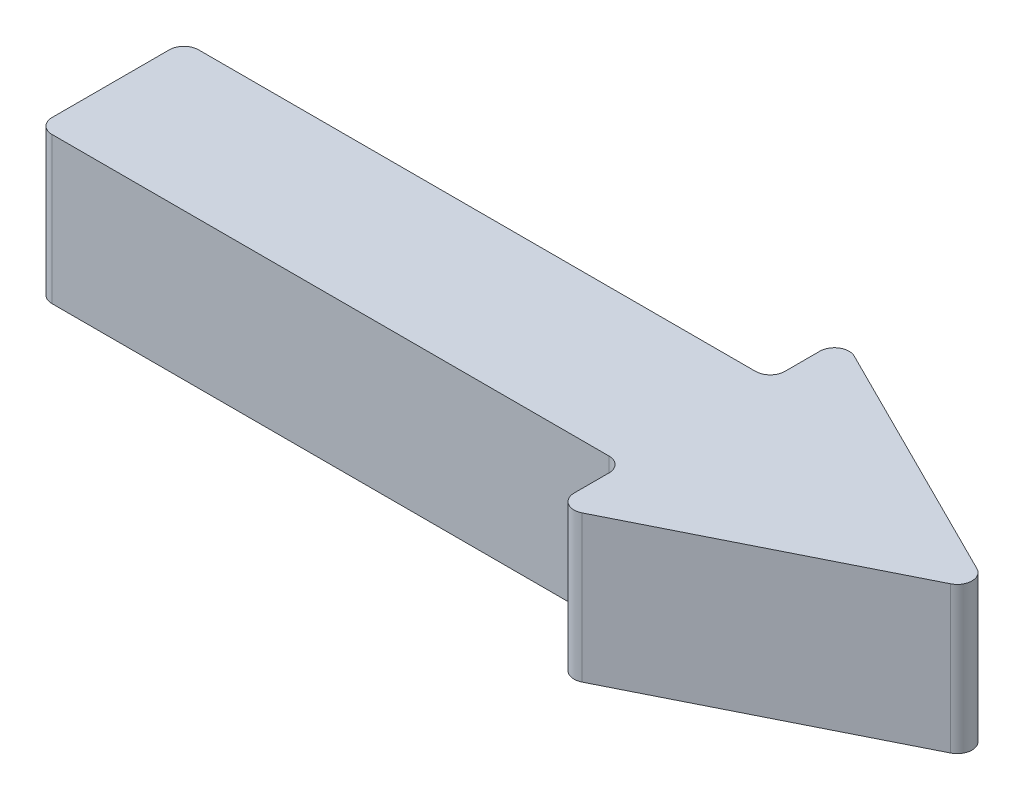
ISO-10303-21;
HEADER;
FILE_DESCRIPTION(('STEP AP214'),'2;1');
FILE_NAME('part.step','',(''),(''),'','','');
FILE_SCHEMA(('AUTOMOTIVE_DESIGN { 1 0 10303 214 1 1 1 1 }'));
ENDSEC;
DATA;
#1=APPLICATION_CONTEXT('core data for automotive mechanical design processes');
#2=APPLICATION_PROTOCOL_DEFINITION('international standard','automotive_design',2000,#1);
#3=PRODUCT_CONTEXT('',#1,'mechanical');
#4=PRODUCT('Part','Part','',(#3));
#5=PRODUCT_RELATED_PRODUCT_CATEGORY('part','',(#4));
#6=PRODUCT_DEFINITION_FORMATION('','',#4);
#7=PRODUCT_DEFINITION_CONTEXT('part definition',#1,'design');
#8=PRODUCT_DEFINITION('design','',#6,#7);
#9=PRODUCT_DEFINITION_SHAPE('','',#8);
#10=(LENGTH_UNIT() NAMED_UNIT(*) SI_UNIT(.MILLI.,.METRE.));
#11=(NAMED_UNIT(*) PLANE_ANGLE_UNIT() SI_UNIT($,.RADIAN.));
#12=(NAMED_UNIT(*) SI_UNIT($,.STERADIAN.) SOLID_ANGLE_UNIT());
#13=UNCERTAINTY_MEASURE_WITH_UNIT(LENGTH_MEASURE(1.E-05),#10,'distance_accuracy_value','');
#14=(GEOMETRIC_REPRESENTATION_CONTEXT(3) GLOBAL_UNCERTAINTY_ASSIGNED_CONTEXT((#13)) GLOBAL_UNIT_ASSIGNED_CONTEXT((#10,
#11,#12)) REPRESENTATION_CONTEXT('',''));
#15=CARTESIAN_POINT('',(0.,0.,0.));
#16=DIRECTION('',(0.,0.,1.));
#17=DIRECTION('',(1.,0.,0.));
#18=AXIS2_PLACEMENT_3D('',#15,#16,#17);
#19=CARTESIAN_POINT('',(0.,0.,0.));
#20=DIRECTION('',(0.,1.,0.));
#21=DIRECTION('',(0.,0.,1.));
#22=AXIS2_PLACEMENT_3D('',#19,#20,#21);
#23=PLANE('',#22);
#24=DIRECTION('',(1.,0.,0.));
#25=VECTOR('',#24,1.);
#26=CARTESIAN_POINT('',(0.,0.,0.));
#27=LINE('',#26,#25);
#28=CARTESIAN_POINT('',(0.635,0.,0.));
#29=VERTEX_POINT('',#28);
#30=CARTESIAN_POINT('',(24.765,0.,0.));
#31=VERTEX_POINT('',#30);
#32=EDGE_CURVE('E154',#29,#31,#27,.T.);
#33=ORIENTED_EDGE('',*,*,#32,.F.);
#34=CARTESIAN_POINT('',(0.635,0.,-0.635));
#35=DIRECTION('',(0.,1.,0.));
#36=DIRECTION('',(0.,0.,1.));
#37=AXIS2_PLACEMENT_3D('',#34,#35,#36);
#38=CIRCLE('',#37,0.635);
#39=CARTESIAN_POINT('',(0.,0.,-0.635));
#40=VERTEX_POINT('',#39);
#41=EDGE_CURVE('E137',#29,#40,#38,.F.);
#42=ORIENTED_EDGE('',*,*,#41,.T.);
#43=DIRECTION('',(0.,0.,-1.));
#44=VECTOR('',#43,1.);
#45=CARTESIAN_POINT('',(0.,0.,0.));
#46=LINE('',#45,#44);
#47=CARTESIAN_POINT('',(0.,0.,-5.715));
#48=VERTEX_POINT('',#47);
#49=EDGE_CURVE('E164',#40,#48,#46,.T.);
#50=ORIENTED_EDGE('',*,*,#49,.T.);
#51=CARTESIAN_POINT('',(0.635,0.,-5.715));
#52=DIRECTION('',(0.,1.,0.));
#53=DIRECTION('',(0.,0.,1.));
#54=AXIS2_PLACEMENT_3D('',#51,#52,#53);
#55=CIRCLE('',#54,0.635);
#56=CARTESIAN_POINT('',(0.635,0.,-6.35));
#57=VERTEX_POINT('',#56);
#58=EDGE_CURVE('E148',#48,#57,#55,.F.);
#59=ORIENTED_EDGE('',*,*,#58,.T.);
#60=DIRECTION('',(1.,0.,0.));
#61=VECTOR('',#60,1.);
#62=CARTESIAN_POINT('',(0.,0.,-6.35));
#63=LINE('',#62,#61);
#64=CARTESIAN_POINT('',(24.765,0.,-6.35));
#65=VERTEX_POINT('',#64);
#66=EDGE_CURVE('E180',#57,#65,#63,.T.);
#67=ORIENTED_EDGE('',*,*,#66,.T.);
#68=CARTESIAN_POINT('',(24.765,0.,-6.985));
#69=DIRECTION('',(0.,1.,0.));
#70=DIRECTION('',(0.,0.,1.));
#71=AXIS2_PLACEMENT_3D('',#68,#69,#70);
#72=CIRCLE('',#71,0.635);
#73=CARTESIAN_POINT('',(25.4,0.,-6.985));
#74=VERTEX_POINT('',#73);
#75=EDGE_CURVE('E229',#65,#74,#72,.T.);
#76=ORIENTED_EDGE('',*,*,#75,.T.);
#77=DIRECTION('',(0.,0.,-1.));
#78=VECTOR('',#77,1.);
#79=CARTESIAN_POINT('',(25.4,0.,0.));
#80=LINE('',#79,#78);
#81=CARTESIAN_POINT('',(25.4,0.,-8.49754841714382));
#82=VERTEX_POINT('',#81);
#83=EDGE_CURVE('E177',#74,#82,#80,.T.);
#84=ORIENTED_EDGE('',*,*,#83,.T.);
#85=CARTESIAN_POINT('',(26.035,0.,-8.49754841714382));
#86=DIRECTION('',(0.,1.,0.));
#87=DIRECTION('',(0.,0.,1.));
#88=AXIS2_PLACEMENT_3D('',#85,#86,#87);
#89=CIRCLE('',#88,0.635);
#90=CARTESIAN_POINT('',(26.3189806331425,0.,-9.06550968342877));
#91=VERTEX_POINT('',#90);
#92=EDGE_CURVE('E187',#82,#91,#89,.F.);
#93=ORIENTED_EDGE('',*,*,#92,.T.);
#94=DIRECTION('',(0.894427190999916,0.,0.447213595499958));
#95=VECTOR('',#94,1.);
#96=CARTESIAN_POINT('',(8.89000000000001,0.,-17.78));
#97=LINE('',#96,#95);
#98=CARTESIAN_POINT('',(36.9640774674301,0.,-3.74296126628495));
#99=VERTEX_POINT('',#98);
#100=EDGE_CURVE('E174',#91,#99,#97,.T.);
#101=ORIENTED_EDGE('',*,*,#100,.T.);
#102=CARTESIAN_POINT('',(36.6800968342876,0.,-3.175));
#103=DIRECTION('',(0.,1.,0.));
#104=DIRECTION('',(0.,0.,1.));
#105=AXIS2_PLACEMENT_3D('',#102,#103,#104);
#106=CIRCLE('',#105,0.635);
#107=CARTESIAN_POINT('',(36.9640774674301,0.,-2.60703873371505));
#108=VERTEX_POINT('',#107);
#109=EDGE_CURVE('E158',#99,#108,#106,.F.);
#110=ORIENTED_EDGE('',*,*,#109,.T.);
#111=DIRECTION('',(-0.894427190999916,0.,0.447213595499958));
#112=VECTOR('',#111,1.);
#113=CARTESIAN_POINT('',(6.34999999999999,0.,12.7));
#114=LINE('',#113,#112);
#115=CARTESIAN_POINT('',(26.3189806331425,0.,2.71550968342876));
#116=VERTEX_POINT('',#115);
#117=EDGE_CURVE('E166',#108,#116,#114,.T.);
#118=ORIENTED_EDGE('',*,*,#117,.T.);
#119=CARTESIAN_POINT('',(26.035,0.,2.14754841714382));
#120=DIRECTION('',(0.,1.,0.));
#121=DIRECTION('',(0.,0.,1.));
#122=AXIS2_PLACEMENT_3D('',#119,#120,#121);
#123=CIRCLE('',#122,0.635);
#124=CARTESIAN_POINT('',(25.4,0.,2.14754841714382));
#125=VERTEX_POINT('',#124);
#126=EDGE_CURVE('E189',#116,#125,#123,.F.);
#127=ORIENTED_EDGE('',*,*,#126,.T.);
#128=DIRECTION('',(0.,0.,-1.));
#129=VECTOR('',#128,1.);
#130=CARTESIAN_POINT('',(25.4,0.,0.));
#131=LINE('',#130,#129);
#132=CARTESIAN_POINT('',(25.4,0.,0.634999999999992));
#133=VERTEX_POINT('',#132);
#134=EDGE_CURVE('E163',#125,#133,#131,.T.);
#135=ORIENTED_EDGE('',*,*,#134,.T.);
#136=CARTESIAN_POINT('',(24.765,0.,0.634999999999992));
#137=DIRECTION('',(0.,1.,0.));
#138=DIRECTION('',(0.,0.,1.));
#139=AXIS2_PLACEMENT_3D('',#136,#137,#138);
#140=CIRCLE('',#139,0.635);
#141=EDGE_CURVE('E43',#133,#31,#140,.T.);
#142=ORIENTED_EDGE('',*,*,#141,.T.);
#143=EDGE_LOOP('',(#33,#42,#50,#59,#67,#76,#84,#93,#101,#110,#118,#127,#135,#142));
#144=FACE_BOUND('',#143,.T.);
#145=CARTESIAN_POINT('',(26.2775484171438,0.,-3.175));
#146=DIRECTION('',(0.,-1.,0.));
#147=DIRECTION('',(0.,0.,-1.));
#148=AXIS2_PLACEMENT_3D('',#145,#146,#147);
#149=CIRCLE('',#148,0.889000000000003);
#150=CARTESIAN_POINT('',(26.2775484171438,0.,-4.06400000000001));
#151=VERTEX_POINT('',#150);
#152=EDGE_CURVE('E263',#151,#151,#149,.F.);
#153=ORIENTED_EDGE('',*,*,#152,.T.);
#154=EDGE_LOOP('',(#153));
#155=FACE_BOUND('',#154,.T.);
#156=CARTESIAN_POINT('',(11.0375484171438,0.,-3.175));
#157=DIRECTION('',(0.,-1.,0.));
#158=DIRECTION('',(0.,0.,-1.));
#159=AXIS2_PLACEMENT_3D('',#156,#157,#158);
#160=CIRCLE('',#159,0.889000000000002);
#161=CARTESIAN_POINT('',(11.0375484171438,0.,-4.06400000000001));
#162=VERTEX_POINT('',#161);
#163=EDGE_CURVE('E269',#162,#162,#160,.T.);
#164=ORIENTED_EDGE('',*,*,#163,.F.);
#165=EDGE_LOOP('',(#164));
#166=FACE_BOUND('',#165,.T.);
#167=ADVANCED_FACE('F35',(#144,#155,#166),#23,.F.);
#168=CARTESIAN_POINT('',(0.,6.35,0.));
#169=DIRECTION('',(-1.,0.,0.));
#170=DIRECTION('',(0.,0.,1.));
#171=AXIS2_PLACEMENT_3D('',#168,#169,#170);
#172=PLANE('',#171);
#173=CARTESIAN_POINT('',(0.,3.175,-3.175));
#174=DIRECTION('',(-1.,0.,0.));
#175=DIRECTION('',(0.,0.,1.));
#176=AXIS2_PLACEMENT_3D('',#173,#174,#175);
#177=CIRCLE('',#176,2.4003);
#178=CARTESIAN_POINT('',(0.,3.175,-0.774700000000001));
#179=VERTEX_POINT('',#178);
#180=EDGE_CURVE('E257',#179,#179,#177,.T.);
#181=ORIENTED_EDGE('',*,*,#180,.F.);
#182=EDGE_LOOP('',(#181));
#183=FACE_BOUND('',#182,.T.);
#184=ORIENTED_EDGE('',*,*,#49,.F.);
#185=DIRECTION('',(0.,-1.,0.));
#186=VECTOR('',#185,1.);
#187=CARTESIAN_POINT('',(0.,6.35,-0.635));
#188=LINE('',#187,#186);
#189=CARTESIAN_POINT('',(0.,6.35,-0.635));
#190=VERTEX_POINT('',#189);
#191=EDGE_CURVE('E142',#40,#190,#188,.F.);
#192=ORIENTED_EDGE('',*,*,#191,.T.);
#193=DIRECTION('',(0.,0.,-1.));
#194=VECTOR('',#193,1.);
#195=CARTESIAN_POINT('',(0.,6.35,0.));
#196=LINE('',#195,#194);
#197=CARTESIAN_POINT('',(0.,6.35,-5.715));
#198=VERTEX_POINT('',#197);
#199=EDGE_CURVE('E183',#190,#198,#196,.T.);
#200=ORIENTED_EDGE('',*,*,#199,.T.);
#201=DIRECTION('',(0.,-1.,0.));
#202=VECTOR('',#201,1.);
#203=CARTESIAN_POINT('',(0.,6.35,-5.715));
#204=LINE('',#203,#202);
#205=EDGE_CURVE('E147',#198,#48,#204,.T.);
#206=ORIENTED_EDGE('',*,*,#205,.T.);
#207=EDGE_LOOP('',(#184,#192,#200,#206));
#208=FACE_BOUND('',#207,.T.);
#209=ADVANCED_FACE('F285',(#183,#208),#172,.T.);
#210=CARTESIAN_POINT('',(0.,6.35,0.));
#211=DIRECTION('',(0.,0.,-1.));
#212=DIRECTION('',(-1.,0.,0.));
#213=AXIS2_PLACEMENT_3D('',#210,#211,#212);
#214=PLANE('',#213);
#215=DIRECTION('',(1.,0.,0.));
#216=VECTOR('',#215,1.);
#217=CARTESIAN_POINT('',(0.,6.35,0.));
#218=LINE('',#217,#216);
#219=CARTESIAN_POINT('',(0.635,6.35,0.));
#220=VERTEX_POINT('',#219);
#221=CARTESIAN_POINT('',(24.765,6.35,0.));
#222=VERTEX_POINT('',#221);
#223=EDGE_CURVE('E157',#220,#222,#218,.T.);
#224=ORIENTED_EDGE('',*,*,#223,.F.);
#225=DIRECTION('',(0.,-1.,0.));
#226=VECTOR('',#225,1.);
#227=CARTESIAN_POINT('',(0.635,0.,0.));
#228=LINE('',#227,#226);
#229=EDGE_CURVE('E141',#220,#29,#228,.T.);
#230=ORIENTED_EDGE('',*,*,#229,.T.);
#231=ORIENTED_EDGE('',*,*,#32,.T.);
#232=DIRECTION('',(0.,-1.,0.));
#233=VECTOR('',#232,1.);
#234=CARTESIAN_POINT('',(24.765,6.35,0.));
#235=LINE('',#234,#233);
#236=EDGE_CURVE('E159',#31,#222,#235,.F.);
#237=ORIENTED_EDGE('',*,*,#236,.T.);
#238=EDGE_LOOP('',(#224,#230,#231,#237));
#239=FACE_BOUND('',#238,.T.);
#240=ADVANCED_FACE('F153',(#239),#214,.F.);
#241=CARTESIAN_POINT('',(25.4,6.35,0.));
#242=DIRECTION('',(-1.,0.,0.));
#243=DIRECTION('',(0.,0.,1.));
#244=AXIS2_PLACEMENT_3D('',#241,#242,#243);
#245=PLANE('',#244);
#246=DIRECTION('',(0.,0.,-1.));
#247=VECTOR('',#246,1.);
#248=CARTESIAN_POINT('',(25.4,6.35,0.));
#249=LINE('',#248,#247);
#250=CARTESIAN_POINT('',(25.4,6.35,2.14754841714382));
#251=VERTEX_POINT('',#250);
#252=CARTESIAN_POINT('',(25.4,6.35,0.634999999999992));
#253=VERTEX_POINT('',#252);
#254=EDGE_CURVE('E251',#251,#253,#249,.T.);
#255=ORIENTED_EDGE('',*,*,#254,.T.);
#256=DIRECTION('',(0.,-1.,0.));
#257=VECTOR('',#256,1.);
#258=CARTESIAN_POINT('',(25.4,6.35,0.634999999999992));
#259=LINE('',#258,#257);
#260=EDGE_CURVE('E216',#253,#133,#259,.T.);
#261=ORIENTED_EDGE('',*,*,#260,.T.);
#262=ORIENTED_EDGE('',*,*,#134,.F.);
#263=DIRECTION('',(0.,-1.,0.));
#264=VECTOR('',#263,1.);
#265=CARTESIAN_POINT('',(25.4,6.35,2.14754841714382));
#266=LINE('',#265,#264);
#267=EDGE_CURVE('E214',#125,#251,#266,.F.);
#268=ORIENTED_EDGE('',*,*,#267,.T.);
#269=EDGE_LOOP('',(#255,#261,#262,#268));
#270=FACE_BOUND('',#269,.T.);
#271=ADVANCED_FACE('F307',(#270),#245,.T.);
#272=CARTESIAN_POINT('',(6.34999999999999,6.35,12.7));
#273=DIRECTION('',(0.447213595499958,0.,0.894427190999916));
#274=DIRECTION('',(0.894427190999916,0.,-0.447213595499958));
#275=AXIS2_PLACEMENT_3D('',#272,#273,#274);
#276=PLANE('',#275);
#277=DIRECTION('',(-0.894427190999916,0.,0.447213595499958));
#278=VECTOR('',#277,1.);
#279=CARTESIAN_POINT('',(6.34999999999999,6.35,12.7));
#280=LINE('',#279,#278);
#281=CARTESIAN_POINT('',(36.9640774674301,6.35,-2.60703873371505));
#282=VERTEX_POINT('',#281);
#283=CARTESIAN_POINT('',(26.3189806331425,6.35,2.71550968342876));
#284=VERTEX_POINT('',#283);
#285=EDGE_CURVE('E248',#282,#284,#280,.T.);
#286=ORIENTED_EDGE('',*,*,#285,.T.);
#287=DIRECTION('',(0.,-1.,0.));
#288=VECTOR('',#287,1.);
#289=CARTESIAN_POINT('',(26.3189806331425,6.35,2.71550968342876));
#290=LINE('',#289,#288);
#291=EDGE_CURVE('E221',#284,#116,#290,.T.);
#292=ORIENTED_EDGE('',*,*,#291,.T.);
#293=ORIENTED_EDGE('',*,*,#117,.F.);
#294=DIRECTION('',(0.,-1.,0.));
#295=VECTOR('',#294,1.);
#296=CARTESIAN_POINT('',(36.9640774674301,6.35,-2.60703873371505));
#297=LINE('',#296,#295);
#298=EDGE_CURVE('E219',#108,#282,#297,.F.);
#299=ORIENTED_EDGE('',*,*,#298,.T.);
#300=EDGE_LOOP('',(#286,#292,#293,#299));
#301=FACE_BOUND('',#300,.T.);
#302=ADVANCED_FACE('F303',(#301),#276,.T.);
#303=CARTESIAN_POINT('',(8.89000000000001,6.35,-17.78));
#304=DIRECTION('',(0.447213595499958,0.,-0.894427190999916));
#305=DIRECTION('',(-0.894427190999916,0.,-0.447213595499958));
#306=AXIS2_PLACEMENT_3D('',#303,#304,#305);
#307=PLANE('',#306);
#308=ORIENTED_EDGE('',*,*,#100,.F.);
#309=DIRECTION('',(0.,-1.,0.));
#310=VECTOR('',#309,1.);
#311=CARTESIAN_POINT('',(26.3189806331425,6.35,-9.06550968342877));
#312=LINE('',#311,#310);
#313=CARTESIAN_POINT('',(26.3189806331425,6.35,-9.06550968342877));
#314=VERTEX_POINT('',#313);
#315=EDGE_CURVE('E227',#91,#314,#312,.F.);
#316=ORIENTED_EDGE('',*,*,#315,.T.);
#317=DIRECTION('',(0.894427190999916,0.,0.447213595499958));
#318=VECTOR('',#317,1.);
#319=CARTESIAN_POINT('',(8.89000000000001,6.35,-17.78));
#320=LINE('',#319,#318);
#321=CARTESIAN_POINT('',(36.9640774674301,6.35,-3.74296126628495));
#322=VERTEX_POINT('',#321);
#323=EDGE_CURVE('E243',#314,#322,#320,.T.);
#324=ORIENTED_EDGE('',*,*,#323,.T.);
#325=DIRECTION('',(0.,-1.,0.));
#326=VECTOR('',#325,1.);
#327=CARTESIAN_POINT('',(36.9640774674301,6.35,-3.74296126628494));
#328=LINE('',#327,#326);
#329=EDGE_CURVE('E224',#322,#99,#328,.T.);
#330=ORIENTED_EDGE('',*,*,#329,.T.);
#331=EDGE_LOOP('',(#308,#316,#324,#330));
#332=FACE_BOUND('',#331,.T.);
#333=ADVANCED_FACE('F300',(#332),#307,.T.);
#334=CARTESIAN_POINT('',(25.4,6.35,0.));
#335=DIRECTION('',(-1.,0.,0.));
#336=DIRECTION('',(0.,0.,1.));
#337=AXIS2_PLACEMENT_3D('',#334,#335,#336);
#338=PLANE('',#337);
#339=ORIENTED_EDGE('',*,*,#83,.F.);
#340=DIRECTION('',(0.,-1.,0.));
#341=VECTOR('',#340,1.);
#342=CARTESIAN_POINT('',(25.4,6.35,-6.985));
#343=LINE('',#342,#341);
#344=CARTESIAN_POINT('',(25.4,6.35,-6.985));
#345=VERTEX_POINT('',#344);
#346=EDGE_CURVE('E212',#74,#345,#343,.F.);
#347=ORIENTED_EDGE('',*,*,#346,.T.);
#348=DIRECTION('',(0.,0.,-1.));
#349=VECTOR('',#348,1.);
#350=CARTESIAN_POINT('',(25.4,6.35,0.));
#351=LINE('',#350,#349);
#352=CARTESIAN_POINT('',(25.4,6.35,-8.49754841714382));
#353=VERTEX_POINT('',#352);
#354=EDGE_CURVE('E242',#345,#353,#351,.T.);
#355=ORIENTED_EDGE('',*,*,#354,.T.);
#356=DIRECTION('',(0.,-1.,0.));
#357=VECTOR('',#356,1.);
#358=CARTESIAN_POINT('',(25.4,6.35,-8.49754841714382));
#359=LINE('',#358,#357);
#360=EDGE_CURVE('E209',#353,#82,#359,.T.);
#361=ORIENTED_EDGE('',*,*,#360,.T.);
#362=EDGE_LOOP('',(#339,#347,#355,#361));
#363=FACE_BOUND('',#362,.T.);
#364=ADVANCED_FACE('F236',(#363),#338,.T.);
#365=CARTESIAN_POINT('',(0.,6.35,-6.35));
#366=DIRECTION('',(0.,0.,-1.));
#367=DIRECTION('',(-1.,0.,0.));
#368=AXIS2_PLACEMENT_3D('',#365,#366,#367);
#369=PLANE('',#368);
#370=ORIENTED_EDGE('',*,*,#66,.F.);
#371=DIRECTION('',(0.,-1.,0.));
#372=VECTOR('',#371,1.);
#373=CARTESIAN_POINT('',(0.635,6.35,-6.35));
#374=LINE('',#373,#372);
#375=CARTESIAN_POINT('',(0.635,6.35,-6.35));
#376=VERTEX_POINT('',#375);
#377=EDGE_CURVE('E57',#57,#376,#374,.F.);
#378=ORIENTED_EDGE('',*,*,#377,.T.);
#379=DIRECTION('',(1.,0.,0.));
#380=VECTOR('',#379,1.);
#381=CARTESIAN_POINT('',(0.,6.35,-6.35));
#382=LINE('',#381,#380);
#383=CARTESIAN_POINT('',(24.765,6.35,-6.35));
#384=VERTEX_POINT('',#383);
#385=EDGE_CURVE('E184',#376,#384,#382,.T.);
#386=ORIENTED_EDGE('',*,*,#385,.T.);
#387=DIRECTION('',(0.,-1.,0.));
#388=VECTOR('',#387,1.);
#389=CARTESIAN_POINT('',(24.765,0.,-6.35));
#390=LINE('',#389,#388);
#391=EDGE_CURVE('E205',#384,#65,#390,.T.);
#392=ORIENTED_EDGE('',*,*,#391,.T.);
#393=EDGE_LOOP('',(#370,#378,#386,#392));
#394=FACE_BOUND('',#393,.T.);
#395=ADVANCED_FACE('F240',(#394),#369,.T.);
#396=CARTESIAN_POINT('',(0.,6.35,0.));
#397=DIRECTION('',(0.,1.,0.));
#398=DIRECTION('',(0.,0.,1.));
#399=AXIS2_PLACEMENT_3D('',#396,#397,#398);
#400=PLANE('',#399);
#401=ORIENTED_EDGE('',*,*,#199,.F.);
#402=CARTESIAN_POINT('',(0.635,6.35,-0.635));
#403=DIRECTION('',(0.,1.,0.));
#404=DIRECTION('',(0.,0.,1.));
#405=AXIS2_PLACEMENT_3D('',#402,#403,#404);
#406=CIRCLE('',#405,0.635);
#407=EDGE_CURVE('E203',#190,#220,#406,.T.);
#408=ORIENTED_EDGE('',*,*,#407,.T.);
#409=ORIENTED_EDGE('',*,*,#223,.T.);
#410=CARTESIAN_POINT('',(24.765,6.35,0.634999999999992));
#411=DIRECTION('',(0.,1.,0.));
#412=DIRECTION('',(0.,0.,1.));
#413=AXIS2_PLACEMENT_3D('',#410,#411,#412);
#414=CIRCLE('',#413,0.635);
#415=EDGE_CURVE('E11',#222,#253,#414,.F.);
#416=ORIENTED_EDGE('',*,*,#415,.T.);
#417=ORIENTED_EDGE('',*,*,#254,.F.);
#418=CARTESIAN_POINT('',(26.035,6.35,2.14754841714382));
#419=DIRECTION('',(0.,1.,0.));
#420=DIRECTION('',(0.,0.,1.));
#421=AXIS2_PLACEMENT_3D('',#418,#419,#420);
#422=CIRCLE('',#421,0.635);
#423=EDGE_CURVE('E199',#251,#284,#422,.T.);
#424=ORIENTED_EDGE('',*,*,#423,.T.);
#425=ORIENTED_EDGE('',*,*,#285,.F.);
#426=CARTESIAN_POINT('',(36.6800968342876,6.35,-3.175));
#427=DIRECTION('',(0.,1.,0.));
#428=DIRECTION('',(0.,0.,1.));
#429=AXIS2_PLACEMENT_3D('',#426,#427,#428);
#430=CIRCLE('',#429,0.635);
#431=EDGE_CURVE('E195',#282,#322,#430,.T.);
#432=ORIENTED_EDGE('',*,*,#431,.T.);
#433=ORIENTED_EDGE('',*,*,#323,.F.);
#434=CARTESIAN_POINT('',(26.035,6.35,-8.49754841714382));
#435=DIRECTION('',(0.,1.,0.));
#436=DIRECTION('',(0.,0.,1.));
#437=AXIS2_PLACEMENT_3D('',#434,#435,#436);
#438=CIRCLE('',#437,0.635);
#439=EDGE_CURVE('E197',#314,#353,#438,.T.);
#440=ORIENTED_EDGE('',*,*,#439,.T.);
#441=ORIENTED_EDGE('',*,*,#354,.F.);
#442=CARTESIAN_POINT('',(24.765,6.35,-6.985));
#443=DIRECTION('',(0.,1.,0.));
#444=DIRECTION('',(0.,0.,1.));
#445=AXIS2_PLACEMENT_3D('',#442,#443,#444);
#446=CIRCLE('',#445,0.635);
#447=EDGE_CURVE('E50',#345,#384,#446,.F.);
#448=ORIENTED_EDGE('',*,*,#447,.T.);
#449=ORIENTED_EDGE('',*,*,#385,.F.);
#450=CARTESIAN_POINT('',(0.635,6.35,-5.715));
#451=DIRECTION('',(0.,1.,0.));
#452=DIRECTION('',(0.,0.,1.));
#453=AXIS2_PLACEMENT_3D('',#450,#451,#452);
#454=CIRCLE('',#453,0.635);
#455=EDGE_CURVE('E201',#376,#198,#454,.T.);
#456=ORIENTED_EDGE('',*,*,#455,.T.);
#457=EDGE_LOOP('',(#401,#408,#409,#416,#417,#424,#425,#432,#433,#440,#441,#448,#449,#456));
#458=FACE_BOUND('',#457,.T.);
#459=ADVANCED_FACE('F294',(#458),#400,.T.);
#460=CARTESIAN_POINT('',(8.89,3.175,-3.175));
#461=DIRECTION('',(-1.,0.,0.));
#462=DIRECTION('',(0.,0.,1.));
#463=AXIS2_PLACEMENT_3D('',#460,#461,#462);
#464=CYLINDRICAL_SURFACE('',#463,2.4003);
#465=CARTESIAN_POINT('',(8.89,3.175,-3.175));
#466=DIRECTION('',(-1.,0.,0.));
#467=DIRECTION('',(0.,0.,1.));
#468=AXIS2_PLACEMENT_3D('',#465,#466,#467);
#469=CIRCLE('',#468,2.4003);
#470=CARTESIAN_POINT('',(8.89,3.175,-0.774700000000001));
#471=VERTEX_POINT('',#470);
#472=EDGE_CURVE('E168',#471,#471,#469,.T.);
#473=ORIENTED_EDGE('',*,*,#472,.F.);
#474=EDGE_LOOP('',(#473));
#475=FACE_BOUND('',#474,.T.);
#476=ORIENTED_EDGE('',*,*,#180,.T.);
#477=EDGE_LOOP('',(#476));
#478=FACE_BOUND('',#477,.T.);
#479=ADVANCED_FACE('F358',(#475,#478),#464,.F.);
#480=CARTESIAN_POINT('',(8.89,3.175,-3.175));
#481=DIRECTION('',(-1.,0.,0.));
#482=DIRECTION('',(0.,0.,1.));
#483=AXIS2_PLACEMENT_3D('',#480,#481,#482);
#484=PLANE('',#483);
#485=ORIENTED_EDGE('',*,*,#472,.T.);
#486=EDGE_LOOP('',(#485));
#487=FACE_BOUND('',#486,.T.);
#488=ADVANCED_FACE('F317',(#487),#484,.T.);
#489=CARTESIAN_POINT('',(0.635,6.35,-0.635));
#490=DIRECTION('',(0.,1.,0.));
#491=DIRECTION('',(0.,0.,1.));
#492=AXIS2_PLACEMENT_3D('',#489,#490,#491);
#493=CYLINDRICAL_SURFACE('',#492,0.635);
#494=ORIENTED_EDGE('',*,*,#407,.F.);
#495=ORIENTED_EDGE('',*,*,#191,.F.);
#496=ORIENTED_EDGE('',*,*,#41,.F.);
#497=ORIENTED_EDGE('',*,*,#229,.F.);
#498=EDGE_LOOP('',(#494,#495,#496,#497));
#499=FACE_BOUND('',#498,.T.);
#500=ADVANCED_FACE('F140',(#499),#493,.T.);
#501=CARTESIAN_POINT('',(0.635,6.35,-5.715));
#502=DIRECTION('',(0.,-1.,0.));
#503=DIRECTION('',(0.,0.,-1.));
#504=AXIS2_PLACEMENT_3D('',#501,#502,#503);
#505=CYLINDRICAL_SURFACE('',#504,0.635);
#506=ORIENTED_EDGE('',*,*,#455,.F.);
#507=ORIENTED_EDGE('',*,*,#377,.F.);
#508=ORIENTED_EDGE('',*,*,#58,.F.);
#509=ORIENTED_EDGE('',*,*,#205,.F.);
#510=EDGE_LOOP('',(#506,#507,#508,#509));
#511=FACE_BOUND('',#510,.T.);
#512=ADVANCED_FACE('F316',(#511),#505,.T.);
#513=CARTESIAN_POINT('',(24.765,6.35,-6.985));
#514=DIRECTION('',(0.,1.,0.));
#515=DIRECTION('',(0.,0.,1.));
#516=AXIS2_PLACEMENT_3D('',#513,#514,#515);
#517=CYLINDRICAL_SURFACE('',#516,0.635);
#518=ORIENTED_EDGE('',*,*,#447,.F.);
#519=ORIENTED_EDGE('',*,*,#346,.F.);
#520=ORIENTED_EDGE('',*,*,#75,.F.);
#521=ORIENTED_EDGE('',*,*,#391,.F.);
#522=EDGE_LOOP('',(#518,#519,#520,#521));
#523=FACE_BOUND('',#522,.T.);
#524=ADVANCED_FACE('F239',(#523),#517,.F.);
#525=CARTESIAN_POINT('',(24.765,6.35,0.634999999999992));
#526=DIRECTION('',(0.,-1.,0.));
#527=DIRECTION('',(0.,0.,-1.));
#528=AXIS2_PLACEMENT_3D('',#525,#526,#527);
#529=CYLINDRICAL_SURFACE('',#528,0.635);
#530=ORIENTED_EDGE('',*,*,#415,.F.);
#531=ORIENTED_EDGE('',*,*,#236,.F.);
#532=ORIENTED_EDGE('',*,*,#141,.F.);
#533=ORIENTED_EDGE('',*,*,#260,.F.);
#534=EDGE_LOOP('',(#530,#531,#532,#533));
#535=FACE_BOUND('',#534,.T.);
#536=ADVANCED_FACE('F323',(#535),#529,.F.);
#537=CARTESIAN_POINT('',(26.035,6.35,2.14754841714382));
#538=DIRECTION('',(0.,-1.,0.));
#539=DIRECTION('',(0.,0.,-1.));
#540=AXIS2_PLACEMENT_3D('',#537,#538,#539);
#541=CYLINDRICAL_SURFACE('',#540,0.635);
#542=ORIENTED_EDGE('',*,*,#423,.F.);
#543=ORIENTED_EDGE('',*,*,#267,.F.);
#544=ORIENTED_EDGE('',*,*,#126,.F.);
#545=ORIENTED_EDGE('',*,*,#291,.F.);
#546=EDGE_LOOP('',(#542,#543,#544,#545));
#547=FACE_BOUND('',#546,.T.);
#548=ADVANCED_FACE('F326',(#547),#541,.T.);
#549=CARTESIAN_POINT('',(26.035,6.35,-8.49754841714382));
#550=DIRECTION('',(0.,-1.,0.));
#551=DIRECTION('',(0.,0.,-1.));
#552=AXIS2_PLACEMENT_3D('',#549,#550,#551);
#553=CYLINDRICAL_SURFACE('',#552,0.635);
#554=ORIENTED_EDGE('',*,*,#439,.F.);
#555=ORIENTED_EDGE('',*,*,#315,.F.);
#556=ORIENTED_EDGE('',*,*,#92,.F.);
#557=ORIENTED_EDGE('',*,*,#360,.F.);
#558=EDGE_LOOP('',(#554,#555,#556,#557));
#559=FACE_BOUND('',#558,.T.);
#560=ADVANCED_FACE('F329',(#559),#553,.T.);
#561=CARTESIAN_POINT('',(36.6800968342876,6.35,-3.175));
#562=DIRECTION('',(0.,-1.,0.));
#563=DIRECTION('',(0.,0.,-1.));
#564=AXIS2_PLACEMENT_3D('',#561,#562,#563);
#565=CYLINDRICAL_SURFACE('',#564,0.635);
#566=ORIENTED_EDGE('',*,*,#431,.F.);
#567=ORIENTED_EDGE('',*,*,#298,.F.);
#568=ORIENTED_EDGE('',*,*,#109,.F.);
#569=ORIENTED_EDGE('',*,*,#329,.F.);
#570=EDGE_LOOP('',(#566,#567,#568,#569));
#571=FACE_BOUND('',#570,.T.);
#572=ADVANCED_FACE('F37',(#571),#565,.T.);
#573=CARTESIAN_POINT('',(26.2775484171438,3.81,-3.175));
#574=DIRECTION('',(0.,-1.,0.));
#575=DIRECTION('',(0.,0.,-1.));
#576=AXIS2_PLACEMENT_3D('',#573,#574,#575);
#577=CYLINDRICAL_SURFACE('',#576,0.889000000000003);
#578=CARTESIAN_POINT('',(26.2775484171438,3.81,-3.175));
#579=DIRECTION('',(0.,-1.,0.));
#580=DIRECTION('',(0.,0.,-1.));
#581=AXIS2_PLACEMENT_3D('',#578,#579,#580);
#582=CIRCLE('',#581,0.889000000000003);
#583=CARTESIAN_POINT('',(26.2775484171438,3.81,-4.06400000000001));
#584=VERTEX_POINT('',#583);
#585=EDGE_CURVE('E266',#584,#584,#582,.F.);
#586=CARTESIAN_POINT('',(26.2775484171438,3.81,-4.06400000000001));
#587=CARTESIAN_POINT('',(26.2775484171438,3.7703125,-4.06400000000001));
#588=CARTESIAN_POINT('',(26.2775484171438,3.730625,-4.06400000000001));
#589=CARTESIAN_POINT('',(26.2775484171438,3.65125,-4.06400000000001));
#590=CARTESIAN_POINT('',(26.2775484171438,3.6115625,-4.06400000000001));
#591=CARTESIAN_POINT('',(26.2775484171438,3.5321875,-4.06400000000001));
#592=CARTESIAN_POINT('',(26.2775484171438,3.4925,-4.06400000000001));
#593=CARTESIAN_POINT('',(26.2775484171438,3.413125,-4.06400000000001));
#594=CARTESIAN_POINT('',(26.2775484171438,3.3734375,-4.06400000000001));
#595=CARTESIAN_POINT('',(26.2775484171438,3.2940625,-4.06400000000001));
#596=CARTESIAN_POINT('',(26.2775484171438,3.254375,-4.06400000000001));
#597=CARTESIAN_POINT('',(26.2775484171438,3.175,-4.06400000000001));
#598=CARTESIAN_POINT('',(26.2775484171438,3.1353125,-4.06400000000001));
#599=CARTESIAN_POINT('',(26.2775484171438,3.0559375,-4.06400000000001));
#600=CARTESIAN_POINT('',(26.2775484171438,3.01625,-4.06400000000001));
#601=CARTESIAN_POINT('',(26.2775484171438,2.936875,-4.06400000000001));
#602=CARTESIAN_POINT('',(26.2775484171438,2.8971875,-4.06400000000001));
#603=CARTESIAN_POINT('',(26.2775484171438,2.8178125,-4.06400000000001));
#604=CARTESIAN_POINT('',(26.2775484171438,2.778125,-4.06400000000001));
#605=CARTESIAN_POINT('',(26.2775484171438,2.69875,-4.06400000000001));
#606=CARTESIAN_POINT('',(26.2775484171438,2.6590625,-4.06400000000001));
#607=CARTESIAN_POINT('',(26.2775484171438,2.5796875,-4.06400000000001));
#608=CARTESIAN_POINT('',(26.2775484171438,2.54,-4.06400000000001));
#609=CARTESIAN_POINT('',(26.2775484171438,2.460625,-4.06400000000001));
#610=CARTESIAN_POINT('',(26.2775484171438,2.4209375,-4.06400000000001));
#611=CARTESIAN_POINT('',(26.2775484171438,2.3415625,-4.06400000000001));
#612=CARTESIAN_POINT('',(26.2775484171438,2.301875,-4.06400000000001));
#613=CARTESIAN_POINT('',(26.2775484171438,2.2225,-4.06400000000001));
#614=CARTESIAN_POINT('',(26.2775484171438,2.1828125,-4.06400000000001));
#615=CARTESIAN_POINT('',(26.2775484171438,2.1034375,-4.06400000000001));
#616=CARTESIAN_POINT('',(26.2775484171438,2.06375,-4.06400000000001));
#617=CARTESIAN_POINT('',(26.2775484171438,1.984375,-4.06400000000001));
#618=CARTESIAN_POINT('',(26.2775484171438,1.9446875,-4.06400000000001));
#619=CARTESIAN_POINT('',(26.2775484171438,1.8653125,-4.06400000000001));
#620=CARTESIAN_POINT('',(26.2775484171438,1.825625,-4.06400000000001));
#621=CARTESIAN_POINT('',(26.2775484171438,1.74625,-4.06400000000001));
#622=CARTESIAN_POINT('',(26.2775484171438,1.7065625,-4.06400000000001));
#623=CARTESIAN_POINT('',(26.2775484171438,1.6271875,-4.06400000000001));
#624=CARTESIAN_POINT('',(26.2775484171438,1.5875,-4.06400000000001));
#625=CARTESIAN_POINT('',(26.2775484171438,1.508125,-4.06400000000001));
#626=CARTESIAN_POINT('',(26.2775484171438,1.4684375,-4.06400000000001));
#627=CARTESIAN_POINT('',(26.2775484171438,1.3890625,-4.06400000000001));
#628=CARTESIAN_POINT('',(26.2775484171438,1.349375,-4.06400000000001));
#629=CARTESIAN_POINT('',(26.2775484171438,1.27,-4.06400000000001));
#630=CARTESIAN_POINT('',(26.2775484171438,1.2303125,-4.06400000000001));
#631=CARTESIAN_POINT('',(26.2775484171438,1.1509375,-4.06400000000001));
#632=CARTESIAN_POINT('',(26.2775484171438,1.11125,-4.06400000000001));
#633=CARTESIAN_POINT('',(26.2775484171438,1.031875,-4.06400000000001));
#634=CARTESIAN_POINT('',(26.2775484171438,0.9921875,-4.06400000000001));
#635=CARTESIAN_POINT('',(26.2775484171438,0.9128125,-4.06400000000001));
#636=CARTESIAN_POINT('',(26.2775484171438,0.873125,-4.06400000000001));
#637=CARTESIAN_POINT('',(26.2775484171438,0.79375,-4.06400000000001));
#638=CARTESIAN_POINT('',(26.2775484171438,0.7540625,-4.06400000000001));
#639=CARTESIAN_POINT('',(26.2775484171438,0.6746875,-4.06400000000001));
#640=CARTESIAN_POINT('',(26.2775484171438,0.635,-4.06400000000001));
#641=CARTESIAN_POINT('',(26.2775484171438,0.555625,-4.06400000000001));
#642=CARTESIAN_POINT('',(26.2775484171438,0.5159375,-4.06400000000001));
#643=CARTESIAN_POINT('',(26.2775484171438,0.4365625,-4.06400000000001));
#644=CARTESIAN_POINT('',(26.2775484171438,0.396875,-4.06400000000001));
#645=CARTESIAN_POINT('',(26.2775484171438,0.3175,-4.06400000000001));
#646=CARTESIAN_POINT('',(26.2775484171438,0.2778125,-4.06400000000001));
#647=CARTESIAN_POINT('',(26.2775484171438,0.1984375,-4.06400000000001));
#648=CARTESIAN_POINT('',(26.2775484171438,0.15875,-4.06400000000001));
#649=CARTESIAN_POINT('',(26.2775484171438,0.0793749999999999,-4.06400000000001));
#650=CARTESIAN_POINT('',(26.2775484171438,0.0396874999999999,-4.06400000000001));
#651=CARTESIAN_POINT('',(26.2775484171438,0.,-4.06400000000001));
#652=B_SPLINE_CURVE_WITH_KNOTS('',3,(#586,#587,#588,#589,#590,#591,#592,#593,#594,#595,#596,
#597,#598,#599,#600,#601,#602,#603,#604,#605,#606,#607,#608,#609,#610,#611,#612,#613,#614,#615,
#616,#617,#618,#619,#620,#621,#622,#623,#624,#625,#626,#627,#628,#629,#630,#631,#632,#633,#634,
#635,#636,#637,#638,#639,#640,#641,#642,#643,#644,#645,#646,#647,#648,#649,#650,#651),
.UNSPECIFIED.,.F.,.F.,(4,2,2,2,2,2,2,2,2,2,2,2,2,2,2,2,2,2,2,2,2,2,2,2,2,2,2,2,2,2,2,2,4),(0.,
0.1190625,0.238125,0.3571875,0.47625,0.5953125,0.714375,0.8334375,0.9525,1.0715625,1.190625,
1.3096875,1.42875,1.5478125,1.666875,1.7859375,1.905,2.0240625,2.143125,2.2621875,2.38125,
2.5003125,2.619375,2.7384375,2.8575,2.9765625,3.095625,3.2146875,3.33375,3.4528125,3.571875,
3.6909375,3.81),.UNSPECIFIED.);
#653=EDGE_CURVE('BSEAM336',#584,#151,#652,.T.);
#654=ORIENTED_EDGE('',*,*,#585,.T.);
#655=ORIENTED_EDGE('',*,*,#152,.F.);
#656=ORIENTED_EDGE('',*,*,#653,.T.);
#657=ORIENTED_EDGE('',*,*,#653,.F.);
#658=EDGE_LOOP('',(#654,#656,#655,#657));
#659=FACE_BOUND('',#658,.T.);
#660=ADVANCED_FACE('F336',(#659),#577,.F.);
#661=CARTESIAN_POINT('',(0.,3.81,0.));
#662=DIRECTION('',(0.,-1.,0.));
#663=DIRECTION('',(0.,0.,-1.));
#664=AXIS2_PLACEMENT_3D('',#661,#662,#663);
#665=PLANE('',#664);
#666=ORIENTED_EDGE('',*,*,#585,.F.);
#667=EDGE_LOOP('',(#666));
#668=FACE_BOUND('',#667,.T.);
#669=ADVANCED_FACE('F280',(#668),#665,.T.);
#670=CARTESIAN_POINT('',(11.0375484171438,3.81,-3.175));
#671=DIRECTION('',(0.,-1.,0.));
#672=DIRECTION('',(0.,0.,-1.));
#673=AXIS2_PLACEMENT_3D('',#670,#671,#672);
#674=CYLINDRICAL_SURFACE('',#673,0.889000000000002);
#675=CARTESIAN_POINT('',(11.0375484171438,3.81,-3.175));
#676=DIRECTION('',(0.,-1.,0.));
#677=DIRECTION('',(0.,0.,-1.));
#678=AXIS2_PLACEMENT_3D('',#675,#676,#677);
#679=CIRCLE('',#678,0.889000000000002);
#680=CARTESIAN_POINT('',(11.0375484171438,3.81,-4.06400000000001));
#681=VERTEX_POINT('',#680);
#682=EDGE_CURVE('E260',#681,#681,#679,.T.);
#683=CARTESIAN_POINT('',(11.0375484171438,3.81,-4.06400000000001));
#684=CARTESIAN_POINT('',(11.0375484171438,3.7703125,-4.06400000000001));
#685=CARTESIAN_POINT('',(11.0375484171438,3.730625,-4.06400000000001));
#686=CARTESIAN_POINT('',(11.0375484171438,3.65125,-4.06400000000001));
#687=CARTESIAN_POINT('',(11.0375484171438,3.6115625,-4.06400000000001));
#688=CARTESIAN_POINT('',(11.0375484171438,3.5321875,-4.06400000000001));
#689=CARTESIAN_POINT('',(11.0375484171438,3.4925,-4.06400000000001));
#690=CARTESIAN_POINT('',(11.0375484171438,3.413125,-4.06400000000001));
#691=CARTESIAN_POINT('',(11.0375484171438,3.3734375,-4.06400000000001));
#692=CARTESIAN_POINT('',(11.0375484171438,3.2940625,-4.06400000000001));
#693=CARTESIAN_POINT('',(11.0375484171438,3.254375,-4.06400000000001));
#694=CARTESIAN_POINT('',(11.0375484171438,3.175,-4.06400000000001));
#695=CARTESIAN_POINT('',(11.0375484171438,3.1353125,-4.06400000000001));
#696=CARTESIAN_POINT('',(11.0375484171438,3.0559375,-4.06400000000001));
#697=CARTESIAN_POINT('',(11.0375484171438,3.01625,-4.06400000000001));
#698=CARTESIAN_POINT('',(11.0375484171438,2.936875,-4.06400000000001));
#699=CARTESIAN_POINT('',(11.0375484171438,2.8971875,-4.06400000000001));
#700=CARTESIAN_POINT('',(11.0375484171438,2.8178125,-4.06400000000001));
#701=CARTESIAN_POINT('',(11.0375484171438,2.778125,-4.06400000000001));
#702=CARTESIAN_POINT('',(11.0375484171438,2.69875,-4.06400000000001));
#703=CARTESIAN_POINT('',(11.0375484171438,2.6590625,-4.06400000000001));
#704=CARTESIAN_POINT('',(11.0375484171438,2.5796875,-4.06400000000001));
#705=CARTESIAN_POINT('',(11.0375484171438,2.54,-4.06400000000001));
#706=CARTESIAN_POINT('',(11.0375484171438,2.460625,-4.06400000000001));
#707=CARTESIAN_POINT('',(11.0375484171438,2.4209375,-4.06400000000001));
#708=CARTESIAN_POINT('',(11.0375484171438,2.3415625,-4.06400000000001));
#709=CARTESIAN_POINT('',(11.0375484171438,2.301875,-4.06400000000001));
#710=CARTESIAN_POINT('',(11.0375484171438,2.2225,-4.06400000000001));
#711=CARTESIAN_POINT('',(11.0375484171438,2.1828125,-4.06400000000001));
#712=CARTESIAN_POINT('',(11.0375484171438,2.1034375,-4.06400000000001));
#713=CARTESIAN_POINT('',(11.0375484171438,2.06375,-4.06400000000001));
#714=CARTESIAN_POINT('',(11.0375484171438,1.984375,-4.06400000000001));
#715=CARTESIAN_POINT('',(11.0375484171438,1.9446875,-4.06400000000001));
#716=CARTESIAN_POINT('',(11.0375484171438,1.8653125,-4.06400000000001));
#717=CARTESIAN_POINT('',(11.0375484171438,1.825625,-4.06400000000001));
#718=CARTESIAN_POINT('',(11.0375484171438,1.74625,-4.06400000000001));
#719=CARTESIAN_POINT('',(11.0375484171438,1.7065625,-4.06400000000001));
#720=CARTESIAN_POINT('',(11.0375484171438,1.6271875,-4.06400000000001));
#721=CARTESIAN_POINT('',(11.0375484171438,1.5875,-4.06400000000001));
#722=CARTESIAN_POINT('',(11.0375484171438,1.508125,-4.06400000000001));
#723=CARTESIAN_POINT('',(11.0375484171438,1.4684375,-4.06400000000001));
#724=CARTESIAN_POINT('',(11.0375484171438,1.3890625,-4.06400000000001));
#725=CARTESIAN_POINT('',(11.0375484171438,1.349375,-4.06400000000001));
#726=CARTESIAN_POINT('',(11.0375484171438,1.27,-4.06400000000001));
#727=CARTESIAN_POINT('',(11.0375484171438,1.2303125,-4.06400000000001));
#728=CARTESIAN_POINT('',(11.0375484171438,1.1509375,-4.06400000000001));
#729=CARTESIAN_POINT('',(11.0375484171438,1.11125,-4.06400000000001));
#730=CARTESIAN_POINT('',(11.0375484171438,1.031875,-4.06400000000001));
#731=CARTESIAN_POINT('',(11.0375484171438,0.9921875,-4.06400000000001));
#732=CARTESIAN_POINT('',(11.0375484171438,0.9128125,-4.06400000000001));
#733=CARTESIAN_POINT('',(11.0375484171438,0.873125,-4.06400000000001));
#734=CARTESIAN_POINT('',(11.0375484171438,0.79375,-4.06400000000001));
#735=CARTESIAN_POINT('',(11.0375484171438,0.7540625,-4.06400000000001));
#736=CARTESIAN_POINT('',(11.0375484171438,0.6746875,-4.06400000000001));
#737=CARTESIAN_POINT('',(11.0375484171438,0.635,-4.06400000000001));
#738=CARTESIAN_POINT('',(11.0375484171438,0.555625,-4.06400000000001));
#739=CARTESIAN_POINT('',(11.0375484171438,0.5159375,-4.06400000000001));
#740=CARTESIAN_POINT('',(11.0375484171438,0.4365625,-4.06400000000001));
#741=CARTESIAN_POINT('',(11.0375484171438,0.396875,-4.06400000000001));
#742=CARTESIAN_POINT('',(11.0375484171438,0.3175,-4.06400000000001));
#743=CARTESIAN_POINT('',(11.0375484171438,0.2778125,-4.06400000000001));
#744=CARTESIAN_POINT('',(11.0375484171438,0.1984375,-4.06400000000001));
#745=CARTESIAN_POINT('',(11.0375484171438,0.15875,-4.06400000000001));
#746=CARTESIAN_POINT('',(11.0375484171438,0.0793749999999999,-4.06400000000001));
#747=CARTESIAN_POINT('',(11.0375484171438,0.0396874999999999,-4.06400000000001));
#748=CARTESIAN_POINT('',(11.0375484171438,0.,-4.06400000000001));
#749=B_SPLINE_CURVE_WITH_KNOTS('',3,(#683,#684,#685,#686,#687,#688,#689,#690,#691,#692,#693,
#694,#695,#696,#697,#698,#699,#700,#701,#702,#703,#704,#705,#706,#707,#708,#709,#710,#711,#712,
#713,#714,#715,#716,#717,#718,#719,#720,#721,#722,#723,#724,#725,#726,#727,#728,#729,#730,#731,
#732,#733,#734,#735,#736,#737,#738,#739,#740,#741,#742,#743,#744,#745,#746,#747,#748),
.UNSPECIFIED.,.F.,.F.,(4,2,2,2,2,2,2,2,2,2,2,2,2,2,2,2,2,2,2,2,2,2,2,2,2,2,2,2,2,2,2,2,4),(0.,
0.1190625,0.238125,0.3571875,0.47625,0.5953125,0.714375,0.8334375,0.9525,1.0715625,1.190625,
1.3096875,1.42875,1.5478125,1.666875,1.7859375,1.905,2.0240625,2.143125,2.2621875,2.38125,
2.5003125,2.619375,2.7384375,2.8575,2.9765625,3.095625,3.2146875,3.33375,3.4528125,3.571875,
3.6909375,3.81),.UNSPECIFIED.);
#750=EDGE_CURVE('BSEAM277',#681,#162,#749,.T.);
#751=ORIENTED_EDGE('',*,*,#682,.F.);
#752=ORIENTED_EDGE('',*,*,#163,.T.);
#753=ORIENTED_EDGE('',*,*,#750,.T.);
#754=ORIENTED_EDGE('',*,*,#750,.F.);
#755=EDGE_LOOP('',(#751,#753,#752,#754));
#756=FACE_BOUND('',#755,.T.);
#757=ADVANCED_FACE('F277',(#756),#674,.F.);
#758=CARTESIAN_POINT('',(0.,3.81,0.));
#759=DIRECTION('',(0.,-1.,0.));
#760=DIRECTION('',(0.,0.,-1.));
#761=AXIS2_PLACEMENT_3D('',#758,#759,#760);
#762=PLANE('',#761);
#763=ORIENTED_EDGE('',*,*,#682,.T.);
#764=EDGE_LOOP('',(#763));
#765=FACE_BOUND('',#764,.T.);
#766=ADVANCED_FACE('F275',(#765),#762,.T.);
#767=CLOSED_SHELL('',(#167,#209,#240,#271,#302,#333,#364,#395,#459,#479,#488,#500,#512,#524,
#536,#548,#560,#572,#660,#669,#757,#766));
#768=MANIFOLD_SOLID_BREP('B2',#767);
#769=ADVANCED_BREP_SHAPE_REPRESENTATION('',(#18,#768),#14);
#770=SHAPE_DEFINITION_REPRESENTATION(#9,#769);
ENDSEC;
END-ISO-10303-21;
